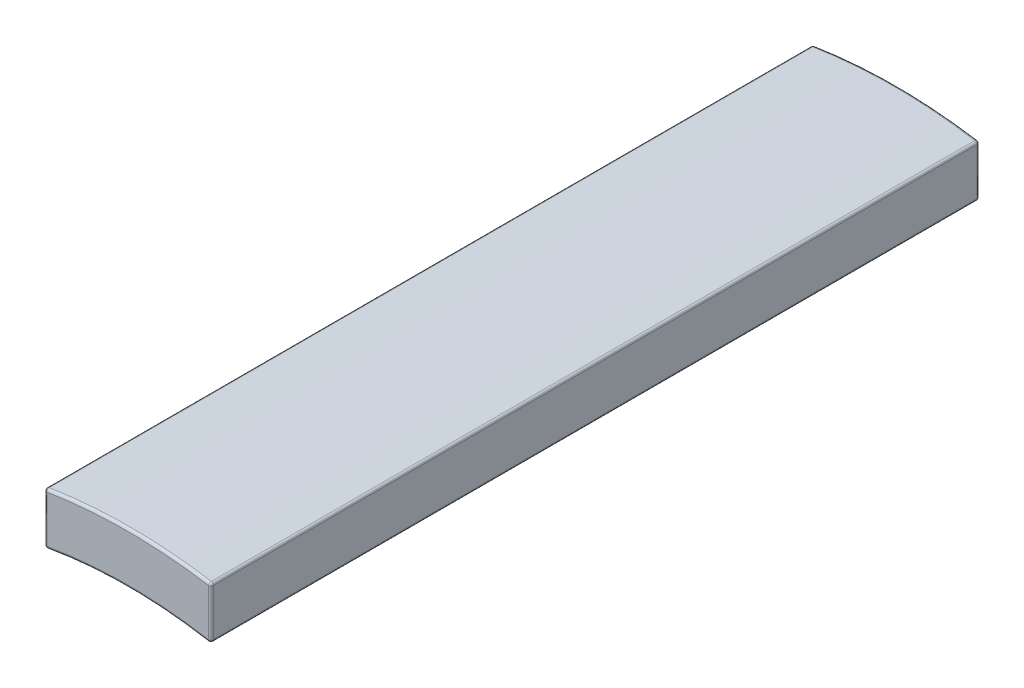
ISO-10303-21;
HEADER;
FILE_DESCRIPTION(('STEP AP214'),'2;1');
FILE_NAME('part.step','',(''),(''),'','','');
FILE_SCHEMA(('AUTOMOTIVE_DESIGN { 1 0 10303 214 1 1 1 1 }'));
ENDSEC;
DATA;
#1=APPLICATION_CONTEXT('core data for automotive mechanical design processes');
#2=APPLICATION_PROTOCOL_DEFINITION('international standard','automotive_design',2000,#1);
#3=PRODUCT_CONTEXT('',#1,'mechanical');
#4=PRODUCT('Part','Part','',(#3));
#5=PRODUCT_RELATED_PRODUCT_CATEGORY('part','',(#4));
#6=PRODUCT_DEFINITION_FORMATION('','',#4);
#7=PRODUCT_DEFINITION_CONTEXT('part definition',#1,'design');
#8=PRODUCT_DEFINITION('design','',#6,#7);
#9=PRODUCT_DEFINITION_SHAPE('','',#8);
#10=(LENGTH_UNIT() NAMED_UNIT(*) SI_UNIT(.MILLI.,.METRE.));
#11=(NAMED_UNIT(*) PLANE_ANGLE_UNIT() SI_UNIT($,.RADIAN.));
#12=(NAMED_UNIT(*) SI_UNIT($,.STERADIAN.) SOLID_ANGLE_UNIT());
#13=UNCERTAINTY_MEASURE_WITH_UNIT(LENGTH_MEASURE(1.E-05),#10,'distance_accuracy_value','');
#14=(GEOMETRIC_REPRESENTATION_CONTEXT(3) GLOBAL_UNCERTAINTY_ASSIGNED_CONTEXT((#13)) GLOBAL_UNIT_ASSIGNED_CONTEXT((#10,
#11,#12)) REPRESENTATION_CONTEXT('',''));
#15=CARTESIAN_POINT('',(0.,0.,0.));
#16=DIRECTION('',(0.,0.,1.));
#17=DIRECTION('',(1.,0.,0.));
#18=AXIS2_PLACEMENT_3D('',#15,#16,#17);
#19=CARTESIAN_POINT('',(0.,0.,0.1));
#20=DIRECTION('',(0.,0.,1.));
#21=DIRECTION('',(1.,0.,0.));
#22=AXIS2_PLACEMENT_3D('',#19,#20,#21);
#23=TOROIDAL_SURFACE('',#22,18.15,0.1);
#24=CARTESIAN_POINT('',(-3.15,17.8745629317195,0.1));
#25=DIRECTION('',(0.984824403951484,0.173553719008276,0.));
#26=DIRECTION('',(-0.173553719008276,0.984824403951484,0.));
#27=AXIS2_PLACEMENT_3D('',#24,#25,#26);
#28=CIRCLE('',#27,0.1);
#29=CARTESIAN_POINT('',(-3.13264462809917,17.7760804913244,0.1));
#30=VERTEX_POINT('',#29);
#31=CARTESIAN_POINT('',(-3.15,17.8745629317195,0.));
#32=VERTEX_POINT('',#31);
#33=EDGE_CURVE('E27',#30,#32,#28,.T.);
#34=ORIENTED_EDGE('',*,*,#33,.T.);
#35=CARTESIAN_POINT('',(0.,0.,0.));
#36=DIRECTION('',(0.,0.,1.));
#37=DIRECTION('',(1.,0.,0.));
#38=AXIS2_PLACEMENT_3D('',#35,#36,#37);
#39=CIRCLE('',#38,18.15);
#40=CARTESIAN_POINT('',(3.15,17.8745629317195,0.));
#41=VERTEX_POINT('',#40);
#42=EDGE_CURVE('E194',#41,#32,#39,.T.);
#43=ORIENTED_EDGE('',*,*,#42,.F.);
#44=CARTESIAN_POINT('',(3.15,17.8745629317195,0.1));
#45=DIRECTION('',(-0.984824403951486,0.173553719008268,0.));
#46=DIRECTION('',(-0.173553719008268,-0.984824403951486,0.));
#47=AXIS2_PLACEMENT_3D('',#44,#45,#46);
#48=CIRCLE('',#47,0.1);
#49=CARTESIAN_POINT('',(3.13264462809917,17.7760804913244,0.1));
#50=VERTEX_POINT('',#49);
#51=EDGE_CURVE('E10',#41,#50,#48,.T.);
#52=ORIENTED_EDGE('',*,*,#51,.T.);
#53=CARTESIAN_POINT('',(0.,0.,0.1));
#54=DIRECTION('',(0.,0.,-1.));
#55=DIRECTION('',(1.,0.,0.));
#56=AXIS2_PLACEMENT_3D('',#53,#54,#55);
#57=CIRCLE('',#56,18.05);
#58=EDGE_CURVE('E276',#30,#50,#57,.T.);
#59=ORIENTED_EDGE('',*,*,#58,.F.);
#60=EDGE_LOOP('',(#34,#43,#52,#59));
#61=FACE_BOUND('',#60,.T.);
#62=ADVANCED_FACE('F16',(#61),#23,.T.);
#63=CARTESIAN_POINT('',(3.15,17.8745629317195,0.1));
#64=DIRECTION('',(0.,1.,0.));
#65=DIRECTION('',(1.,0.,0.));
#66=AXIS2_PLACEMENT_3D('',#63,#64,#65);
#67=SPHERICAL_SURFACE('',#66,0.1);
#68=CARTESIAN_POINT('',(3.15,17.8745629317195,0.1));
#69=DIRECTION('',(0.,-1.,0.));
#70=DIRECTION('',(0.,0.,-1.));
#71=AXIS2_PLACEMENT_3D('',#68,#69,#70);
#72=CIRCLE('',#71,0.1);
#73=CARTESIAN_POINT('',(3.25,17.8745629317195,0.1));
#74=VERTEX_POINT('',#73);
#75=EDGE_CURVE('E204',#41,#74,#72,.T.);
#76=ORIENTED_EDGE('',*,*,#75,.T.);
#77=CARTESIAN_POINT('',(3.15,17.8745629317195,0.1));
#78=DIRECTION('',(0.,0.,1.));
#79=DIRECTION('',(-1.,0.,0.));
#80=AXIS2_PLACEMENT_3D('',#77,#78,#79);
#81=CIRCLE('',#80,0.1);
#82=EDGE_CURVE('E233',#50,#74,#81,.T.);
#83=ORIENTED_EDGE('',*,*,#82,.F.);
#84=ORIENTED_EDGE('',*,*,#51,.F.);
#85=EDGE_LOOP('',(#76,#83,#84));
#86=FACE_BOUND('',#85,.T.);
#87=ADVANCED_FACE('F392',(#86),#67,.T.);
#88=CARTESIAN_POINT('',(-3.15,17.8745629317195,0.1));
#89=DIRECTION('',(0.,1.,0.));
#90=DIRECTION('',(1.,0.,0.));
#91=AXIS2_PLACEMENT_3D('',#88,#89,#90);
#92=SPHERICAL_SURFACE('',#91,0.1);
#93=CARTESIAN_POINT('',(-3.15,17.8745629317195,0.1));
#94=DIRECTION('',(0.,0.,1.));
#95=DIRECTION('',(-1.,0.,0.));
#96=AXIS2_PLACEMENT_3D('',#93,#94,#95);
#97=CIRCLE('',#96,0.1);
#98=CARTESIAN_POINT('',(-3.25,17.8745629317195,0.1));
#99=VERTEX_POINT('',#98);
#100=EDGE_CURVE('E211',#99,#30,#97,.T.);
#101=ORIENTED_EDGE('',*,*,#100,.F.);
#102=CARTESIAN_POINT('',(-3.15,17.8745629317195,0.1));
#103=DIRECTION('',(0.,-1.,0.));
#104=DIRECTION('',(0.,0.,-1.));
#105=AXIS2_PLACEMENT_3D('',#102,#103,#104);
#106=CIRCLE('',#105,0.1);
#107=EDGE_CURVE('E200',#99,#32,#106,.T.);
#108=ORIENTED_EDGE('',*,*,#107,.T.);
#109=ORIENTED_EDGE('',*,*,#33,.F.);
#110=EDGE_LOOP('',(#101,#108,#109));
#111=FACE_BOUND('',#110,.T.);
#112=ADVANCED_FACE('F652',(#111),#92,.T.);
#113=CARTESIAN_POINT('',(3.15,17.8745629317195,0.1));
#114=DIRECTION('',(0.,1.,0.));
#115=DIRECTION('',(0.,0.,1.));
#116=AXIS2_PLACEMENT_3D('',#113,#114,#115);
#117=CYLINDRICAL_SURFACE('',#116,0.1);
#118=CARTESIAN_POINT('',(3.15,19.6997461912584,0.1));
#119=DIRECTION('',(0.,-1.,0.));
#120=DIRECTION('',(0.,0.,-1.));
#121=AXIS2_PLACEMENT_3D('',#118,#119,#120);
#122=CIRCLE('',#121,0.1);
#123=CARTESIAN_POINT('',(3.15,19.6997461912584,0.));
#124=VERTEX_POINT('',#123);
#125=CARTESIAN_POINT('',(3.25,19.6997461912584,0.1));
#126=VERTEX_POINT('',#125);
#127=EDGE_CURVE('E198',#124,#126,#122,.T.);
#128=ORIENTED_EDGE('',*,*,#127,.T.);
#129=DIRECTION('',(0.,1.,0.));
#130=VECTOR('',#129,1.);
#131=CARTESIAN_POINT('',(3.25,17.8745629317195,0.1));
#132=LINE('',#131,#130);
#133=EDGE_CURVE('E237',#74,#126,#132,.T.);
#134=ORIENTED_EDGE('',*,*,#133,.F.);
#135=ORIENTED_EDGE('',*,*,#75,.F.);
#136=DIRECTION('',(0.,-1.,0.));
#137=VECTOR('',#136,1.);
#138=CARTESIAN_POINT('',(3.15,17.8745629317195,0.));
#139=LINE('',#138,#137);
#140=EDGE_CURVE('E190',#124,#41,#139,.T.);
#141=ORIENTED_EDGE('',*,*,#140,.F.);
#142=EDGE_LOOP('',(#128,#134,#135,#141));
#143=FACE_BOUND('',#142,.T.);
#144=ADVANCED_FACE('F18',(#143),#117,.T.);
#145=CARTESIAN_POINT('',(-3.15,17.8745629317195,0.1));
#146=DIRECTION('',(0.,-1.,0.));
#147=DIRECTION('',(0.,0.,-1.));
#148=AXIS2_PLACEMENT_3D('',#145,#146,#147);
#149=CYLINDRICAL_SURFACE('',#148,0.1);
#150=CARTESIAN_POINT('',(-3.15,19.6997461912584,0.1));
#151=DIRECTION('',(0.,-1.,0.));
#152=DIRECTION('',(0.,0.,-1.));
#153=AXIS2_PLACEMENT_3D('',#150,#151,#152);
#154=CIRCLE('',#153,0.1);
#155=CARTESIAN_POINT('',(-3.25,19.6997461912584,0.1));
#156=VERTEX_POINT('',#155);
#157=CARTESIAN_POINT('',(-3.15,19.6997461912584,0.));
#158=VERTEX_POINT('',#157);
#159=EDGE_CURVE('E42',#156,#158,#154,.T.);
#160=ORIENTED_EDGE('',*,*,#159,.T.);
#161=DIRECTION('',(0.,1.,0.));
#162=VECTOR('',#161,1.);
#163=CARTESIAN_POINT('',(-3.15,17.8745629317195,0.));
#164=LINE('',#163,#162);
#165=EDGE_CURVE('E299',#32,#158,#164,.T.);
#166=ORIENTED_EDGE('',*,*,#165,.F.);
#167=ORIENTED_EDGE('',*,*,#107,.F.);
#168=DIRECTION('',(0.,-1.,0.));
#169=VECTOR('',#168,1.);
#170=CARTESIAN_POINT('',(-3.25,17.8745629317195,0.1));
#171=LINE('',#170,#169);
#172=EDGE_CURVE('E257',#156,#99,#171,.T.);
#173=ORIENTED_EDGE('',*,*,#172,.F.);
#174=EDGE_LOOP('',(#160,#166,#167,#173));
#175=FACE_BOUND('',#174,.T.);
#176=ADVANCED_FACE('F693',(#175),#149,.T.);
#177=CARTESIAN_POINT('',(3.15,19.6997461912584,0.1));
#178=DIRECTION('',(0.,1.,0.));
#179=DIRECTION('',(1.,0.,0.));
#180=AXIS2_PLACEMENT_3D('',#177,#178,#179);
#181=SPHERICAL_SURFACE('',#180,0.1);
#182=CARTESIAN_POINT('',(3.15,19.6997461912584,0.1));
#183=DIRECTION('',(0.987455949436511,-0.157894736842109,0.));
#184=DIRECTION('',(0.157894736842109,0.987455949436511,0.));
#185=AXIS2_PLACEMENT_3D('',#182,#183,#184);
#186=CIRCLE('',#185,0.1);
#187=CARTESIAN_POINT('',(3.16578947368421,19.798491786202,0.1));
#188=VERTEX_POINT('',#187);
#189=EDGE_CURVE('E199',#124,#188,#186,.T.);
#190=ORIENTED_EDGE('',*,*,#189,.T.);
#191=CARTESIAN_POINT('',(3.15,19.6997461912584,0.1));
#192=DIRECTION('',(0.,0.,1.));
#193=DIRECTION('',(-1.,0.,0.));
#194=AXIS2_PLACEMENT_3D('',#191,#192,#193);
#195=CIRCLE('',#194,0.0999999999999981);
#196=EDGE_CURVE('E177',#126,#188,#195,.T.);
#197=ORIENTED_EDGE('',*,*,#196,.F.);
#198=ORIENTED_EDGE('',*,*,#127,.F.);
#199=EDGE_LOOP('',(#190,#197,#198));
#200=FACE_BOUND('',#199,.T.);
#201=ADVANCED_FACE('F357',(#200),#181,.T.);
#202=CARTESIAN_POINT('',(-3.15,19.6997461912584,0.1));
#203=DIRECTION('',(0.,1.,0.));
#204=DIRECTION('',(1.,0.,0.));
#205=AXIS2_PLACEMENT_3D('',#202,#203,#204);
#206=SPHERICAL_SURFACE('',#205,0.1);
#207=CARTESIAN_POINT('',(-3.15,19.6997461912584,0.1));
#208=DIRECTION('',(0.,0.,1.));
#209=DIRECTION('',(-1.,0.,0.));
#210=AXIS2_PLACEMENT_3D('',#207,#208,#209);
#211=CIRCLE('',#210,0.0999999999999981);
#212=CARTESIAN_POINT('',(-3.16578947368421,19.798491786202,0.1));
#213=VERTEX_POINT('',#212);
#214=EDGE_CURVE('E164',#213,#156,#211,.T.);
#215=ORIENTED_EDGE('',*,*,#214,.F.);
#216=CARTESIAN_POINT('',(-3.15,19.6997461912584,0.1));
#217=DIRECTION('',(-0.987455949436512,-0.157894736842104,0.));
#218=DIRECTION('',(0.157894736842104,-0.987455949436512,0.));
#219=AXIS2_PLACEMENT_3D('',#216,#217,#218);
#220=CIRCLE('',#219,0.1);
#221=EDGE_CURVE('E227',#213,#158,#220,.T.);
#222=ORIENTED_EDGE('',*,*,#221,.T.);
#223=ORIENTED_EDGE('',*,*,#159,.F.);
#224=EDGE_LOOP('',(#215,#222,#223));
#225=FACE_BOUND('',#224,.T.);
#226=ADVANCED_FACE('F363',(#225),#206,.T.);
#227=CARTESIAN_POINT('',(0.,0.,0.1));
#228=DIRECTION('',(0.,0.,1.));
#229=DIRECTION('',(1.,0.,0.));
#230=AXIS2_PLACEMENT_3D('',#227,#228,#229);
#231=TOROIDAL_SURFACE('',#230,19.95,0.1);
#232=ORIENTED_EDGE('',*,*,#221,.F.);
#233=CARTESIAN_POINT('',(0.,0.,0.1));
#234=DIRECTION('',(0.,0.,1.));
#235=DIRECTION('',(1.,0.,0.));
#236=AXIS2_PLACEMENT_3D('',#233,#234,#235);
#237=CIRCLE('',#236,20.05);
#238=EDGE_CURVE('E173',#188,#213,#237,.T.);
#239=ORIENTED_EDGE('',*,*,#238,.F.);
#240=ORIENTED_EDGE('',*,*,#189,.F.);
#241=CARTESIAN_POINT('',(0.,0.,0.));
#242=DIRECTION('',(0.,0.,-1.));
#243=DIRECTION('',(1.,0.,0.));
#244=AXIS2_PLACEMENT_3D('',#241,#242,#243);
#245=CIRCLE('',#244,19.95);
#246=EDGE_CURVE('E261',#158,#124,#245,.T.);
#247=ORIENTED_EDGE('',*,*,#246,.F.);
#248=EDGE_LOOP('',(#232,#239,#240,#247));
#249=FACE_BOUND('',#248,.T.);
#250=ADVANCED_FACE('F361',(#249),#231,.T.);
#251=CARTESIAN_POINT('',(-3.15,17.8745629317195,29.9));
#252=DIRECTION('',(0.,1.,0.));
#253=DIRECTION('',(0.,0.,1.));
#254=AXIS2_PLACEMENT_3D('',#251,#252,#253);
#255=CYLINDRICAL_SURFACE('',#254,0.1);
#256=CARTESIAN_POINT('',(-3.15,19.6997461912584,29.9));
#257=DIRECTION('',(0.,-1.,0.));
#258=DIRECTION('',(0.,0.,-1.));
#259=AXIS2_PLACEMENT_3D('',#256,#257,#258);
#260=CIRCLE('',#259,0.1);
#261=CARTESIAN_POINT('',(-3.15,19.6997461912584,30.));
#262=VERTEX_POINT('',#261);
#263=CARTESIAN_POINT('',(-3.25,19.6997461912584,29.9));
#264=VERTEX_POINT('',#263);
#265=EDGE_CURVE('E282',#262,#264,#260,.T.);
#266=ORIENTED_EDGE('',*,*,#265,.T.);
#267=DIRECTION('',(0.,1.,0.));
#268=VECTOR('',#267,1.);
#269=CARTESIAN_POINT('',(-3.25,19.6997461912584,29.9));
#270=LINE('',#269,#268);
#271=CARTESIAN_POINT('',(-3.25,17.8745629317195,29.9));
#272=VERTEX_POINT('',#271);
#273=EDGE_CURVE('E251',#272,#264,#270,.T.);
#274=ORIENTED_EDGE('',*,*,#273,.F.);
#275=CARTESIAN_POINT('',(-3.15,17.8745629317195,29.9));
#276=DIRECTION('',(0.,1.,0.));
#277=DIRECTION('',(0.,0.,1.));
#278=AXIS2_PLACEMENT_3D('',#275,#276,#277);
#279=CIRCLE('',#278,0.1);
#280=CARTESIAN_POINT('',(-3.15,17.8745629317195,30.));
#281=VERTEX_POINT('',#280);
#282=EDGE_CURVE('E264',#272,#281,#279,.T.);
#283=ORIENTED_EDGE('',*,*,#282,.T.);
#284=DIRECTION('',(0.,-1.,0.));
#285=VECTOR('',#284,1.);
#286=CARTESIAN_POINT('',(-3.15,17.8745629317195,30.));
#287=LINE('',#286,#285);
#288=EDGE_CURVE('E240',#262,#281,#287,.T.);
#289=ORIENTED_EDGE('',*,*,#288,.F.);
#290=EDGE_LOOP('',(#266,#274,#283,#289));
#291=FACE_BOUND('',#290,.T.);
#292=ADVANCED_FACE('F333',(#291),#255,.T.);
#293=CARTESIAN_POINT('',(-3.15,17.8745629317195,29.9));
#294=DIRECTION('',(0.,1.,0.));
#295=DIRECTION('',(1.,0.,0.));
#296=AXIS2_PLACEMENT_3D('',#293,#294,#295);
#297=SPHERICAL_SURFACE('',#296,0.1);
#298=CARTESIAN_POINT('',(-3.15,17.8745629317195,29.9));
#299=DIRECTION('',(0.,0.,-1.));
#300=DIRECTION('',(-1.,0.,0.));
#301=AXIS2_PLACEMENT_3D('',#298,#299,#300);
#302=CIRCLE('',#301,0.1);
#303=CARTESIAN_POINT('',(-3.13264462809917,17.7760804913244,29.9));
#304=VERTEX_POINT('',#303);
#305=EDGE_CURVE('E280',#304,#272,#302,.T.);
#306=ORIENTED_EDGE('',*,*,#305,.F.);
#307=CARTESIAN_POINT('',(-3.15,17.8745629317195,29.9));
#308=DIRECTION('',(-0.984824403951486,-0.173553719008264,0.));
#309=DIRECTION('',(0.173553719008264,-0.984824403951486,0.));
#310=AXIS2_PLACEMENT_3D('',#307,#308,#309);
#311=CIRCLE('',#310,0.1);
#312=EDGE_CURVE('E239',#304,#281,#311,.T.);
#313=ORIENTED_EDGE('',*,*,#312,.T.);
#314=ORIENTED_EDGE('',*,*,#282,.F.);
#315=EDGE_LOOP('',(#306,#313,#314));
#316=FACE_BOUND('',#315,.T.);
#317=ADVANCED_FACE('F337',(#316),#297,.T.);
#318=CARTESIAN_POINT('',(-3.15,19.6997461912584,29.9));
#319=DIRECTION('',(0.,1.,0.));
#320=DIRECTION('',(1.,0.,0.));
#321=AXIS2_PLACEMENT_3D('',#318,#319,#320);
#322=SPHERICAL_SURFACE('',#321,0.1);
#323=CARTESIAN_POINT('',(-3.15,19.6997461912584,29.9));
#324=DIRECTION('',(-0.987455949436513,-0.157894736842095,0.));
#325=DIRECTION('',(0.157894736842095,-0.987455949436513,0.));
#326=AXIS2_PLACEMENT_3D('',#323,#324,#325);
#327=CIRCLE('',#326,0.1);
#328=CARTESIAN_POINT('',(-3.16578947368421,19.798491786202,29.9));
#329=VERTEX_POINT('',#328);
#330=EDGE_CURVE('E108',#262,#329,#327,.T.);
#331=ORIENTED_EDGE('',*,*,#330,.T.);
#332=CARTESIAN_POINT('',(-3.15,19.6997461912584,29.9));
#333=DIRECTION('',(0.,0.,-1.));
#334=DIRECTION('',(-1.,0.,0.));
#335=AXIS2_PLACEMENT_3D('',#332,#333,#334);
#336=CIRCLE('',#335,0.0999999999999981);
#337=EDGE_CURVE('E314',#264,#329,#336,.T.);
#338=ORIENTED_EDGE('',*,*,#337,.F.);
#339=ORIENTED_EDGE('',*,*,#265,.F.);
#340=EDGE_LOOP('',(#331,#338,#339));
#341=FACE_BOUND('',#340,.T.);
#342=ADVANCED_FACE('F617',(#341),#322,.T.);
#343=CARTESIAN_POINT('',(0.,0.,29.9));
#344=DIRECTION('',(0.,0.,1.));
#345=DIRECTION('',(1.,0.,0.));
#346=AXIS2_PLACEMENT_3D('',#343,#344,#345);
#347=TOROIDAL_SURFACE('',#346,18.15,0.1);
#348=CARTESIAN_POINT('',(3.15,17.8745629317195,29.9));
#349=DIRECTION('',(-0.984824403951486,0.173553719008268,0.));
#350=DIRECTION('',(-0.173553719008268,-0.984824403951486,0.));
#351=AXIS2_PLACEMENT_3D('',#348,#349,#350);
#352=CIRCLE('',#351,0.1);
#353=CARTESIAN_POINT('',(3.13264462809917,17.7760804913244,29.9));
#354=VERTEX_POINT('',#353);
#355=CARTESIAN_POINT('',(3.15,17.8745629317195,30.));
#356=VERTEX_POINT('',#355);
#357=EDGE_CURVE('E152',#354,#356,#352,.T.);
#358=ORIENTED_EDGE('',*,*,#357,.T.);
#359=CARTESIAN_POINT('',(0.,0.,30.));
#360=DIRECTION('',(0.,0.,-1.));
#361=DIRECTION('',(1.,0.,0.));
#362=AXIS2_PLACEMENT_3D('',#359,#360,#361);
#363=CIRCLE('',#362,18.15);
#364=EDGE_CURVE('E224',#281,#356,#363,.T.);
#365=ORIENTED_EDGE('',*,*,#364,.F.);
#366=ORIENTED_EDGE('',*,*,#312,.F.);
#367=CARTESIAN_POINT('',(0.,0.,29.9));
#368=DIRECTION('',(0.,0.,1.));
#369=DIRECTION('',(1.,0.,0.));
#370=AXIS2_PLACEMENT_3D('',#367,#368,#369);
#371=CIRCLE('',#370,18.05);
#372=EDGE_CURVE('E188',#354,#304,#371,.T.);
#373=ORIENTED_EDGE('',*,*,#372,.F.);
#374=EDGE_LOOP('',(#358,#365,#366,#373));
#375=FACE_BOUND('',#374,.T.);
#376=ADVANCED_FACE('F342',(#375),#347,.T.);
#377=CARTESIAN_POINT('',(0.,0.,29.9));
#378=DIRECTION('',(0.,0.,1.));
#379=DIRECTION('',(1.,0.,0.));
#380=AXIS2_PLACEMENT_3D('',#377,#378,#379);
#381=TOROIDAL_SURFACE('',#380,19.95,0.1);
#382=CARTESIAN_POINT('',(3.15,19.6997461912584,29.9));
#383=DIRECTION('',(-0.987455949436511,0.157894736842109,0.));
#384=DIRECTION('',(-0.157894736842109,-0.987455949436511,0.));
#385=AXIS2_PLACEMENT_3D('',#382,#383,#384);
#386=CIRCLE('',#385,0.1);
#387=CARTESIAN_POINT('',(3.15,19.6997461912584,30.));
#388=VERTEX_POINT('',#387);
#389=CARTESIAN_POINT('',(3.16578947368421,19.798491786202,29.9));
#390=VERTEX_POINT('',#389);
#391=EDGE_CURVE('E20',#388,#390,#386,.T.);
#392=ORIENTED_EDGE('',*,*,#391,.T.);
#393=CARTESIAN_POINT('',(0.,0.,29.9));
#394=DIRECTION('',(0.,0.,-1.));
#395=DIRECTION('',(1.,0.,0.));
#396=AXIS2_PLACEMENT_3D('',#393,#394,#395);
#397=CIRCLE('',#396,20.05);
#398=EDGE_CURVE('E144',#329,#390,#397,.T.);
#399=ORIENTED_EDGE('',*,*,#398,.F.);
#400=ORIENTED_EDGE('',*,*,#330,.F.);
#401=CARTESIAN_POINT('',(0.,0.,30.));
#402=DIRECTION('',(0.,0.,1.));
#403=DIRECTION('',(1.,0.,0.));
#404=AXIS2_PLACEMENT_3D('',#401,#402,#403);
#405=CIRCLE('',#404,19.95);
#406=EDGE_CURVE('E147',#388,#262,#405,.T.);
#407=ORIENTED_EDGE('',*,*,#406,.F.);
#408=EDGE_LOOP('',(#392,#399,#400,#407));
#409=FACE_BOUND('',#408,.T.);
#410=ADVANCED_FACE('F143',(#409),#381,.T.);
#411=CARTESIAN_POINT('',(3.15,17.8745629317195,29.9));
#412=DIRECTION('',(0.,1.,0.));
#413=DIRECTION('',(1.,0.,0.));
#414=AXIS2_PLACEMENT_3D('',#411,#412,#413);
#415=SPHERICAL_SURFACE('',#414,0.1);
#416=CARTESIAN_POINT('',(3.15,17.8745629317195,29.9));
#417=DIRECTION('',(0.,0.,-1.));
#418=DIRECTION('',(-1.,0.,0.));
#419=AXIS2_PLACEMENT_3D('',#416,#417,#418);
#420=CIRCLE('',#419,0.1);
#421=CARTESIAN_POINT('',(3.25,17.8745629317195,29.9));
#422=VERTEX_POINT('',#421);
#423=EDGE_CURVE('E232',#422,#354,#420,.T.);
#424=ORIENTED_EDGE('',*,*,#423,.F.);
#425=CARTESIAN_POINT('',(3.15,17.8745629317195,29.9));
#426=DIRECTION('',(0.,-1.,0.));
#427=DIRECTION('',(0.,0.,-1.));
#428=AXIS2_PLACEMENT_3D('',#425,#426,#427);
#429=CIRCLE('',#428,0.1);
#430=EDGE_CURVE('E285',#422,#356,#429,.T.);
#431=ORIENTED_EDGE('',*,*,#430,.T.);
#432=ORIENTED_EDGE('',*,*,#357,.F.);
#433=EDGE_LOOP('',(#424,#431,#432));
#434=FACE_BOUND('',#433,.T.);
#435=ADVANCED_FACE('F388',(#434),#415,.T.);
#436=CARTESIAN_POINT('',(3.15,19.6997461912584,29.9));
#437=DIRECTION('',(0.,1.,0.));
#438=DIRECTION('',(1.,0.,0.));
#439=AXIS2_PLACEMENT_3D('',#436,#437,#438);
#440=SPHERICAL_SURFACE('',#439,0.1);
#441=CARTESIAN_POINT('',(3.15,19.6997461912584,29.9));
#442=DIRECTION('',(0.,1.,0.));
#443=DIRECTION('',(0.,0.,1.));
#444=AXIS2_PLACEMENT_3D('',#441,#442,#443);
#445=CIRCLE('',#444,0.1);
#446=CARTESIAN_POINT('',(3.25,19.6997461912584,29.9));
#447=VERTEX_POINT('',#446);
#448=EDGE_CURVE('E153',#388,#447,#445,.T.);
#449=ORIENTED_EDGE('',*,*,#448,.T.);
#450=CARTESIAN_POINT('',(3.15,19.6997461912584,29.9));
#451=DIRECTION('',(0.,0.,-1.));
#452=DIRECTION('',(-1.,0.,0.));
#453=AXIS2_PLACEMENT_3D('',#450,#451,#452);
#454=CIRCLE('',#453,0.0999999999999981);
#455=EDGE_CURVE('E167',#390,#447,#454,.T.);
#456=ORIENTED_EDGE('',*,*,#455,.F.);
#457=ORIENTED_EDGE('',*,*,#391,.F.);
#458=EDGE_LOOP('',(#449,#456,#457));
#459=FACE_BOUND('',#458,.T.);
#460=ADVANCED_FACE('F168',(#459),#440,.T.);
#461=CARTESIAN_POINT('',(3.15,17.8745629317195,29.9));
#462=DIRECTION('',(0.,-1.,0.));
#463=DIRECTION('',(0.,0.,-1.));
#464=AXIS2_PLACEMENT_3D('',#461,#462,#463);
#465=CYLINDRICAL_SURFACE('',#464,0.1);
#466=ORIENTED_EDGE('',*,*,#430,.F.);
#467=DIRECTION('',(0.,-1.,0.));
#468=VECTOR('',#467,1.);
#469=CARTESIAN_POINT('',(3.25,17.8745629317195,29.9));
#470=LINE('',#469,#468);
#471=EDGE_CURVE('E184',#447,#422,#470,.T.);
#472=ORIENTED_EDGE('',*,*,#471,.F.);
#473=ORIENTED_EDGE('',*,*,#448,.F.);
#474=DIRECTION('',(0.,1.,0.));
#475=VECTOR('',#474,1.);
#476=CARTESIAN_POINT('',(3.15,19.6997461912584,30.));
#477=LINE('',#476,#475);
#478=EDGE_CURVE('E195',#356,#388,#477,.T.);
#479=ORIENTED_EDGE('',*,*,#478,.F.);
#480=EDGE_LOOP('',(#466,#472,#473,#479));
#481=FACE_BOUND('',#480,.T.);
#482=ADVANCED_FACE('F345',(#481),#465,.T.);
#483=CARTESIAN_POINT('',(-3.15,17.8745629317195,0.));
#484=DIRECTION('',(0.,0.,1.));
#485=DIRECTION('',(1.,0.,0.));
#486=AXIS2_PLACEMENT_3D('',#483,#484,#485);
#487=PLANE('',#486);
#488=ORIENTED_EDGE('',*,*,#140,.T.);
#489=ORIENTED_EDGE('',*,*,#42,.T.);
#490=ORIENTED_EDGE('',*,*,#165,.T.);
#491=ORIENTED_EDGE('',*,*,#246,.T.);
#492=EDGE_LOOP('',(#488,#489,#490,#491));
#493=FACE_BOUND('',#492,.T.);
#494=ADVANCED_FACE('F398',(#493),#487,.F.);
#495=CARTESIAN_POINT('',(-3.15,17.8745629317195,30.));
#496=DIRECTION('',(0.,0.,1.));
#497=DIRECTION('',(1.,0.,0.));
#498=AXIS2_PLACEMENT_3D('',#495,#496,#497);
#499=PLANE('',#498);
#500=ORIENTED_EDGE('',*,*,#406,.T.);
#501=ORIENTED_EDGE('',*,*,#288,.T.);
#502=ORIENTED_EDGE('',*,*,#364,.T.);
#503=ORIENTED_EDGE('',*,*,#478,.T.);
#504=EDGE_LOOP('',(#500,#501,#502,#503));
#505=FACE_BOUND('',#504,.T.);
#506=ADVANCED_FACE('F343',(#505),#499,.T.);
#507=CARTESIAN_POINT('',(-3.25,17.8745629317195,30.));
#508=DIRECTION('',(1.,0.,0.));
#509=DIRECTION('',(0.,1.,0.));
#510=AXIS2_PLACEMENT_3D('',#507,#508,#509);
#511=PLANE('',#510);
#512=DIRECTION('',(0.,0.,-1.));
#513=VECTOR('',#512,1.);
#514=CARTESIAN_POINT('',(-3.25,19.6997461912584,30.));
#515=LINE('',#514,#513);
#516=EDGE_CURVE('E220',#264,#156,#515,.T.);
#517=ORIENTED_EDGE('',*,*,#516,.T.);
#518=ORIENTED_EDGE('',*,*,#172,.T.);
#519=DIRECTION('',(0.,0.,-1.));
#520=VECTOR('',#519,1.);
#521=CARTESIAN_POINT('',(-3.25,17.8745629317195,30.));
#522=LINE('',#521,#520);
#523=EDGE_CURVE('E216',#272,#99,#522,.T.);
#524=ORIENTED_EDGE('',*,*,#523,.F.);
#525=ORIENTED_EDGE('',*,*,#273,.T.);
#526=EDGE_LOOP('',(#517,#518,#524,#525));
#527=FACE_BOUND('',#526,.T.);
#528=ADVANCED_FACE('F636',(#527),#511,.F.);
#529=CARTESIAN_POINT('',(-3.15,19.6997461912584,30.));
#530=DIRECTION('',(0.,0.,-1.));
#531=DIRECTION('',(-1.,0.,0.));
#532=AXIS2_PLACEMENT_3D('',#529,#530,#531);
#533=CYLINDRICAL_SURFACE('',#532,0.0999999999999981);
#534=DIRECTION('',(0.,0.,-1.));
#535=VECTOR('',#534,1.);
#536=CARTESIAN_POINT('',(-3.16578947368421,19.798491786202,30.));
#537=LINE('',#536,#535);
#538=EDGE_CURVE('E162',#329,#213,#537,.T.);
#539=ORIENTED_EDGE('',*,*,#538,.T.);
#540=ORIENTED_EDGE('',*,*,#214,.T.);
#541=ORIENTED_EDGE('',*,*,#516,.F.);
#542=ORIENTED_EDGE('',*,*,#337,.T.);
#543=EDGE_LOOP('',(#539,#540,#541,#542));
#544=FACE_BOUND('',#543,.T.);
#545=ADVANCED_FACE('F366',(#544),#533,.T.);
#546=CARTESIAN_POINT('',(0.,0.,30.));
#547=DIRECTION('',(0.,0.,-1.));
#548=DIRECTION('',(-1.,0.,0.));
#549=AXIS2_PLACEMENT_3D('',#546,#547,#548);
#550=CYLINDRICAL_SURFACE('',#549,20.05);
#551=DIRECTION('',(0.,0.,-1.));
#552=VECTOR('',#551,1.);
#553=CARTESIAN_POINT('',(3.16578947368421,19.798491786202,30.));
#554=LINE('',#553,#552);
#555=EDGE_CURVE('E159',#390,#188,#554,.T.);
#556=ORIENTED_EDGE('',*,*,#555,.T.);
#557=ORIENTED_EDGE('',*,*,#238,.T.);
#558=ORIENTED_EDGE('',*,*,#538,.F.);
#559=ORIENTED_EDGE('',*,*,#398,.T.);
#560=EDGE_LOOP('',(#556,#557,#558,#559));
#561=FACE_BOUND('',#560,.T.);
#562=ADVANCED_FACE('F156',(#561),#550,.T.);
#563=CARTESIAN_POINT('',(3.15,19.6997461912584,30.));
#564=DIRECTION('',(0.,0.,-1.));
#565=DIRECTION('',(-1.,0.,0.));
#566=AXIS2_PLACEMENT_3D('',#563,#564,#565);
#567=CYLINDRICAL_SURFACE('',#566,0.0999999999999981);
#568=DIRECTION('',(0.,0.,-1.));
#569=VECTOR('',#568,1.);
#570=CARTESIAN_POINT('',(3.25,19.6997461912584,30.));
#571=LINE('',#570,#569);
#572=EDGE_CURVE('E210',#447,#126,#571,.T.);
#573=ORIENTED_EDGE('',*,*,#572,.T.);
#574=ORIENTED_EDGE('',*,*,#196,.T.);
#575=ORIENTED_EDGE('',*,*,#555,.F.);
#576=ORIENTED_EDGE('',*,*,#455,.T.);
#577=EDGE_LOOP('',(#573,#574,#575,#576));
#578=FACE_BOUND('',#577,.T.);
#579=ADVANCED_FACE('F175',(#578),#567,.T.);
#580=CARTESIAN_POINT('',(3.25,17.8745629317195,30.));
#581=DIRECTION('',(-1.,0.,0.));
#582=DIRECTION('',(0.,0.,1.));
#583=AXIS2_PLACEMENT_3D('',#580,#581,#582);
#584=PLANE('',#583);
#585=DIRECTION('',(0.,0.,-1.));
#586=VECTOR('',#585,1.);
#587=CARTESIAN_POINT('',(3.25,17.8745629317195,30.));
#588=LINE('',#587,#586);
#589=EDGE_CURVE('E228',#422,#74,#588,.T.);
#590=ORIENTED_EDGE('',*,*,#589,.T.);
#591=ORIENTED_EDGE('',*,*,#133,.T.);
#592=ORIENTED_EDGE('',*,*,#572,.F.);
#593=ORIENTED_EDGE('',*,*,#471,.T.);
#594=EDGE_LOOP('',(#590,#591,#592,#593));
#595=FACE_BOUND('',#594,.T.);
#596=ADVANCED_FACE('F348',(#595),#584,.F.);
#597=CARTESIAN_POINT('',(3.15,17.8745629317195,30.));
#598=DIRECTION('',(0.,0.,-1.));
#599=DIRECTION('',(-1.,0.,0.));
#600=AXIS2_PLACEMENT_3D('',#597,#598,#599);
#601=CYLINDRICAL_SURFACE('',#600,0.1);
#602=DIRECTION('',(0.,0.,-1.));
#603=VECTOR('',#602,1.);
#604=CARTESIAN_POINT('',(3.13264462809917,17.7760804913244,30.));
#605=LINE('',#604,#603);
#606=EDGE_CURVE('E279',#354,#50,#605,.T.);
#607=ORIENTED_EDGE('',*,*,#606,.T.);
#608=ORIENTED_EDGE('',*,*,#82,.T.);
#609=ORIENTED_EDGE('',*,*,#589,.F.);
#610=ORIENTED_EDGE('',*,*,#423,.T.);
#611=EDGE_LOOP('',(#607,#608,#609,#610));
#612=FACE_BOUND('',#611,.T.);
#613=ADVANCED_FACE('F389',(#612),#601,.T.);
#614=CARTESIAN_POINT('',(0.,0.,30.));
#615=DIRECTION('',(0.,0.,-1.));
#616=DIRECTION('',(-1.,0.,0.));
#617=AXIS2_PLACEMENT_3D('',#614,#615,#616);
#618=CYLINDRICAL_SURFACE('',#617,18.05);
#619=DIRECTION('',(0.,0.,-1.));
#620=VECTOR('',#619,1.);
#621=CARTESIAN_POINT('',(-3.13264462809917,17.7760804913244,30.));
#622=LINE('',#621,#620);
#623=EDGE_CURVE('E215',#304,#30,#622,.T.);
#624=ORIENTED_EDGE('',*,*,#623,.T.);
#625=ORIENTED_EDGE('',*,*,#58,.T.);
#626=ORIENTED_EDGE('',*,*,#606,.F.);
#627=ORIENTED_EDGE('',*,*,#372,.T.);
#628=EDGE_LOOP('',(#624,#625,#626,#627));
#629=FACE_BOUND('',#628,.T.);
#630=ADVANCED_FACE('F384',(#629),#618,.F.);
#631=CARTESIAN_POINT('',(-3.15,17.8745629317195,30.));
#632=DIRECTION('',(0.,0.,-1.));
#633=DIRECTION('',(-1.,0.,0.));
#634=AXIS2_PLACEMENT_3D('',#631,#632,#633);
#635=CYLINDRICAL_SURFACE('',#634,0.1);
#636=ORIENTED_EDGE('',*,*,#523,.T.);
#637=ORIENTED_EDGE('',*,*,#100,.T.);
#638=ORIENTED_EDGE('',*,*,#623,.F.);
#639=ORIENTED_EDGE('',*,*,#305,.T.);
#640=EDGE_LOOP('',(#636,#637,#638,#639));
#641=FACE_BOUND('',#640,.T.);
#642=ADVANCED_FACE('F661',(#641),#635,.T.);
#643=CLOSED_SHELL('',(#62,#87,#112,#144,#176,#201,#226,#250,#292,#317,#342,#376,#410,#435,#460,
#482,#494,#506,#528,#545,#562,#579,#596,#613,#630,#642));
#644=MANIFOLD_SOLID_BREP('B1',#643);
#645=ADVANCED_BREP_SHAPE_REPRESENTATION('',(#18,#644),#14);
#646=SHAPE_DEFINITION_REPRESENTATION(#9,#645);
ENDSEC;
END-ISO-10303-21;
